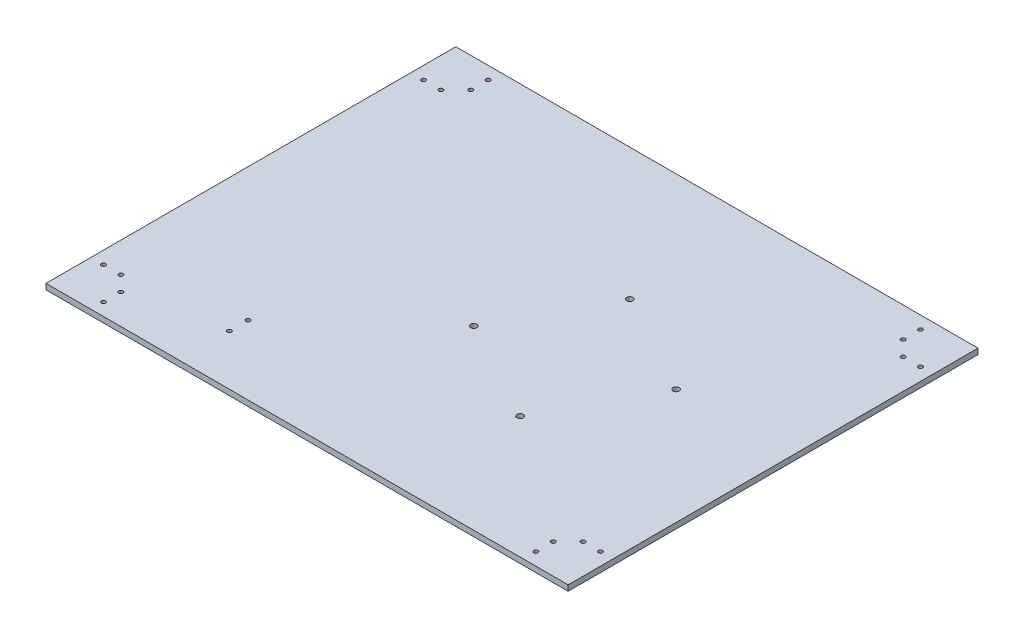
ISO-10303-21;
HEADER;
FILE_DESCRIPTION(('STEP AP214'),'2;1');
FILE_NAME('part.step','',(''),(''),'','','');
FILE_SCHEMA(('AUTOMOTIVE_DESIGN { 1 0 10303 214 1 1 1 1 }'));
ENDSEC;
DATA;
#1=APPLICATION_CONTEXT('core data for automotive mechanical design processes');
#2=APPLICATION_PROTOCOL_DEFINITION('international standard','automotive_design',2000,#1);
#3=PRODUCT_CONTEXT('',#1,'mechanical');
#4=PRODUCT('Part','Part','',(#3));
#5=PRODUCT_RELATED_PRODUCT_CATEGORY('part','',(#4));
#6=PRODUCT_DEFINITION_FORMATION('','',#4);
#7=PRODUCT_DEFINITION_CONTEXT('part definition',#1,'design');
#8=PRODUCT_DEFINITION('design','',#6,#7);
#9=PRODUCT_DEFINITION_SHAPE('','',#8);
#10=(LENGTH_UNIT() NAMED_UNIT(*) SI_UNIT(.MILLI.,.METRE.));
#11=(NAMED_UNIT(*) PLANE_ANGLE_UNIT() SI_UNIT($,.RADIAN.));
#12=(NAMED_UNIT(*) SI_UNIT($,.STERADIAN.) SOLID_ANGLE_UNIT());
#13=UNCERTAINTY_MEASURE_WITH_UNIT(LENGTH_MEASURE(1.E-05),#10,'distance_accuracy_value','');
#14=(GEOMETRIC_REPRESENTATION_CONTEXT(3) GLOBAL_UNCERTAINTY_ASSIGNED_CONTEXT((#13)) GLOBAL_UNIT_ASSIGNED_CONTEXT((#10,
#11,#12)) REPRESENTATION_CONTEXT('',''));
#15=CARTESIAN_POINT('',(0.,0.,0.));
#16=DIRECTION('',(0.,0.,1.));
#17=DIRECTION('',(1.,0.,0.));
#18=AXIS2_PLACEMENT_3D('',#15,#16,#17);
#19=CARTESIAN_POINT('',(-279.,6.,-219.));
#20=DIRECTION('',(1.,0.,0.));
#21=DIRECTION('',(0.,0.,-1.));
#22=AXIS2_PLACEMENT_3D('',#19,#20,#21);
#23=PLANE('',#22);
#24=DIRECTION('',(0.,0.,1.));
#25=VECTOR('',#24,1.);
#26=CARTESIAN_POINT('',(-279.,0.,-219.));
#27=LINE('',#26,#25);
#28=CARTESIAN_POINT('',(-279.,0.,-219.));
#29=VERTEX_POINT('',#28);
#30=CARTESIAN_POINT('',(-279.,0.,219.));
#31=VERTEX_POINT('',#30);
#32=EDGE_CURVE('E103',#29,#31,#27,.T.);
#33=ORIENTED_EDGE('',*,*,#32,.T.);
#34=DIRECTION('',(0.,-1.,0.));
#35=VECTOR('',#34,1.);
#36=CARTESIAN_POINT('',(-279.,6.,219.));
#37=LINE('',#36,#35);
#38=CARTESIAN_POINT('',(-279.,6.,219.));
#39=VERTEX_POINT('',#38);
#40=EDGE_CURVE('E11',#39,#31,#37,.T.);
#41=ORIENTED_EDGE('',*,*,#40,.F.);
#42=DIRECTION('',(0.,0.,1.));
#43=VECTOR('',#42,1.);
#44=CARTESIAN_POINT('',(-279.,6.,-219.));
#45=LINE('',#44,#43);
#46=CARTESIAN_POINT('',(-279.,6.,-219.));
#47=VERTEX_POINT('',#46);
#48=EDGE_CURVE('E90',#47,#39,#45,.T.);
#49=ORIENTED_EDGE('',*,*,#48,.F.);
#50=DIRECTION('',(0.,-1.,0.));
#51=VECTOR('',#50,1.);
#52=CARTESIAN_POINT('',(-279.,6.,-219.));
#53=LINE('',#52,#51);
#54=EDGE_CURVE('E99',#47,#29,#53,.T.);
#55=ORIENTED_EDGE('',*,*,#54,.T.);
#56=EDGE_LOOP('',(#33,#41,#49,#55));
#57=FACE_BOUND('',#56,.T.);
#58=ADVANCED_FACE('F37',(#57),#23,.F.);
#59=CARTESIAN_POINT('',(-279.,6.,219.));
#60=DIRECTION('',(0.,0.,-1.));
#61=DIRECTION('',(-1.,0.,0.));
#62=AXIS2_PLACEMENT_3D('',#59,#60,#61);
#63=PLANE('',#62);
#64=DIRECTION('',(1.,0.,0.));
#65=VECTOR('',#64,1.);
#66=CARTESIAN_POINT('',(-279.,0.,219.));
#67=LINE('',#66,#65);
#68=CARTESIAN_POINT('',(279.,0.,219.));
#69=VERTEX_POINT('',#68);
#70=EDGE_CURVE('E94',#31,#69,#67,.T.);
#71=ORIENTED_EDGE('',*,*,#70,.T.);
#72=DIRECTION('',(0.,-1.,0.));
#73=VECTOR('',#72,1.);
#74=CARTESIAN_POINT('',(279.,6.,219.));
#75=LINE('',#74,#73);
#76=CARTESIAN_POINT('',(279.,6.,219.));
#77=VERTEX_POINT('',#76);
#78=EDGE_CURVE('E46',#77,#69,#75,.T.);
#79=ORIENTED_EDGE('',*,*,#78,.F.);
#80=DIRECTION('',(1.,0.,0.));
#81=VECTOR('',#80,1.);
#82=CARTESIAN_POINT('',(-279.,6.,219.));
#83=LINE('',#82,#81);
#84=EDGE_CURVE('E85',#39,#77,#83,.T.);
#85=ORIENTED_EDGE('',*,*,#84,.F.);
#86=ORIENTED_EDGE('',*,*,#40,.T.);
#87=EDGE_LOOP('',(#71,#79,#85,#86));
#88=FACE_BOUND('',#87,.T.);
#89=ADVANCED_FACE('F93',(#88),#63,.F.);
#90=CARTESIAN_POINT('',(279.,6.,-219.));
#91=DIRECTION('',(-1.,0.,0.));
#92=DIRECTION('',(0.,0.,1.));
#93=AXIS2_PLACEMENT_3D('',#90,#91,#92);
#94=PLANE('',#93);
#95=DIRECTION('',(0.,0.,-1.));
#96=VECTOR('',#95,1.);
#97=CARTESIAN_POINT('',(279.,0.,-219.));
#98=LINE('',#97,#96);
#99=CARTESIAN_POINT('',(279.,0.,-219.));
#100=VERTEX_POINT('',#99);
#101=EDGE_CURVE('E72',#69,#100,#98,.T.);
#102=ORIENTED_EDGE('',*,*,#101,.T.);
#103=DIRECTION('',(0.,-1.,0.));
#104=VECTOR('',#103,1.);
#105=CARTESIAN_POINT('',(279.,6.,-219.));
#106=LINE('',#105,#104);
#107=CARTESIAN_POINT('',(279.,6.,-219.));
#108=VERTEX_POINT('',#107);
#109=EDGE_CURVE('E95',#108,#100,#106,.T.);
#110=ORIENTED_EDGE('',*,*,#109,.F.);
#111=DIRECTION('',(0.,0.,-1.));
#112=VECTOR('',#111,1.);
#113=CARTESIAN_POINT('',(279.,6.,-219.));
#114=LINE('',#113,#112);
#115=EDGE_CURVE('E88',#77,#108,#114,.T.);
#116=ORIENTED_EDGE('',*,*,#115,.F.);
#117=ORIENTED_EDGE('',*,*,#78,.T.);
#118=EDGE_LOOP('',(#102,#110,#116,#117));
#119=FACE_BOUND('',#118,.T.);
#120=ADVANCED_FACE('F97',(#119),#94,.F.);
#121=CARTESIAN_POINT('',(-279.,6.,-219.));
#122=DIRECTION('',(0.,0.,1.));
#123=DIRECTION('',(1.,0.,0.));
#124=AXIS2_PLACEMENT_3D('',#121,#122,#123);
#125=PLANE('',#124);
#126=DIRECTION('',(-1.,0.,0.));
#127=VECTOR('',#126,1.);
#128=CARTESIAN_POINT('',(-279.,0.,-219.));
#129=LINE('',#128,#127);
#130=EDGE_CURVE('E78',#100,#29,#129,.T.);
#131=ORIENTED_EDGE('',*,*,#130,.T.);
#132=ORIENTED_EDGE('',*,*,#54,.F.);
#133=DIRECTION('',(-1.,0.,0.));
#134=VECTOR('',#133,1.);
#135=CARTESIAN_POINT('',(-279.,6.,-219.));
#136=LINE('',#135,#134);
#137=EDGE_CURVE('E55',#108,#47,#136,.T.);
#138=ORIENTED_EDGE('',*,*,#137,.F.);
#139=ORIENTED_EDGE('',*,*,#109,.T.);
#140=EDGE_LOOP('',(#131,#132,#138,#139));
#141=FACE_BOUND('',#140,.T.);
#142=ADVANCED_FACE('F228',(#141),#125,.F.);
#143=CARTESIAN_POINT('',(0.,6.,0.));
#144=DIRECTION('',(0.,1.,0.));
#145=DIRECTION('',(0.,0.,1.));
#146=AXIS2_PLACEMENT_3D('',#143,#144,#145);
#147=PLANE('',#146);
#148=CARTESIAN_POINT('',(-136.921607377057,6.,165.135242980903));
#149=DIRECTION('',(0.,1.,0.));
#150=DIRECTION('',(0.,0.,1.));
#151=AXIS2_PLACEMENT_3D('',#148,#149,#150);
#152=CIRCLE('',#151,2.25000000000001);
#153=CARTESIAN_POINT('',(-136.921607377057,6.,167.385242980903));
#154=VERTEX_POINT('',#153);
#155=EDGE_CURVE('E556',#154,#154,#152,.T.);
#156=ORIENTED_EDGE('',*,*,#155,.F.);
#157=EDGE_LOOP('',(#156));
#158=FACE_BOUND('',#157,.T.);
#159=CARTESIAN_POINT('',(-136.921607377057,6.,145.135242980903));
#160=DIRECTION('',(0.,1.,0.));
#161=DIRECTION('',(0.,0.,1.));
#162=AXIS2_PLACEMENT_3D('',#159,#160,#161);
#163=CIRCLE('',#162,2.25000000000001);
#164=CARTESIAN_POINT('',(-136.921607377057,6.,147.385242980903));
#165=VERTEX_POINT('',#164);
#166=EDGE_CURVE('E560',#165,#165,#163,.T.);
#167=ORIENTED_EDGE('',*,*,#166,.F.);
#168=EDGE_LOOP('',(#167));
#169=FACE_BOUND('',#168,.T.);
#170=CARTESIAN_POINT('',(-11.0471393696576,6.,29.950902321598));
#171=DIRECTION('',(0.,1.,0.));
#172=DIRECTION('',(0.,0.,1.));
#173=AXIS2_PLACEMENT_3D('',#170,#171,#172);
#174=CIRCLE('',#173,3.30000000000001);
#175=CARTESIAN_POINT('',(-11.0471393696576,6.,33.250902321598));
#176=VERTEX_POINT('',#175);
#177=EDGE_CURVE('E164',#176,#176,#174,.T.);
#178=ORIENTED_EDGE('',*,*,#177,.F.);
#179=EDGE_LOOP('',(#178));
#180=FACE_BOUND('',#179,.T.);
#181=CARTESIAN_POINT('',(97.1704024808377,6.,88.5459898732358));
#182=DIRECTION('',(0.,1.,0.));
#183=DIRECTION('',(0.,0.,1.));
#184=AXIS2_PLACEMENT_3D('',#181,#182,#183);
#185=CIRCLE('',#184,3.3);
#186=CARTESIAN_POINT('',(97.1704024808377,6.,91.8459898732358));
#187=VERTEX_POINT('',#186);
#188=EDGE_CURVE('E572',#187,#187,#185,.T.);
#189=ORIENTED_EDGE('',*,*,#188,.F.);
#190=EDGE_LOOP('',(#189));
#191=FACE_BOUND('',#190,.T.);
#192=CARTESIAN_POINT('',(47.547947966774,6.,-78.2666396454225));
#193=DIRECTION('',(0.,1.,0.));
#194=DIRECTION('',(0.,0.,1.));
#195=AXIS2_PLACEMENT_3D('',#192,#193,#194);
#196=CIRCLE('',#195,3.3);
#197=CARTESIAN_POINT('',(47.547947966774,6.,-74.9666396454225));
#198=VERTEX_POINT('',#197);
#199=EDGE_CURVE('E575',#198,#198,#196,.T.);
#200=ORIENTED_EDGE('',*,*,#199,.F.);
#201=EDGE_LOOP('',(#200));
#202=FACE_BOUND('',#201,.T.);
#203=CARTESIAN_POINT('',(155.765489817269,6.,-19.6715520937847));
#204=DIRECTION('',(0.,1.,0.));
#205=DIRECTION('',(0.,0.,1.));
#206=AXIS2_PLACEMENT_3D('',#203,#204,#205);
#207=CIRCLE('',#206,3.3);
#208=CARTESIAN_POINT('',(155.765489817269,6.,-16.3715520937847));
#209=VERTEX_POINT('',#208);
#210=EDGE_CURVE('E569',#209,#209,#207,.T.);
#211=ORIENTED_EDGE('',*,*,#210,.F.);
#212=EDGE_LOOP('',(#211));
#213=FACE_BOUND('',#212,.T.);
#214=CARTESIAN_POINT('',(265.5,6.,171.));
#215=DIRECTION('',(0.,1.,0.));
#216=DIRECTION('',(0.,0.,1.));
#217=AXIS2_PLACEMENT_3D('',#214,#215,#216);
#218=CIRCLE('',#217,2.24999999999996);
#219=CARTESIAN_POINT('',(265.5,6.,173.25));
#220=VERTEX_POINT('',#219);
#221=EDGE_CURVE('E187',#220,#220,#218,.T.);
#222=ORIENTED_EDGE('',*,*,#221,.F.);
#223=EDGE_LOOP('',(#222));
#224=FACE_BOUND('',#223,.T.);
#225=CARTESIAN_POINT('',(265.5,6.,-171.));
#226=DIRECTION('',(0.,1.,0.));
#227=DIRECTION('',(0.,0.,1.));
#228=AXIS2_PLACEMENT_3D('',#225,#226,#227);
#229=CIRCLE('',#228,2.24999999999996);
#230=CARTESIAN_POINT('',(265.5,6.,-168.75));
#231=VERTEX_POINT('',#230);
#232=EDGE_CURVE('E204',#231,#231,#229,.T.);
#233=ORIENTED_EDGE('',*,*,#232,.F.);
#234=EDGE_LOOP('',(#233));
#235=FACE_BOUND('',#234,.T.);
#236=CARTESIAN_POINT('',(247.,6.,-171.));
#237=DIRECTION('',(0.,1.,0.));
#238=DIRECTION('',(0.,0.,1.));
#239=AXIS2_PLACEMENT_3D('',#236,#237,#238);
#240=CIRCLE('',#239,2.25000000000001);
#241=CARTESIAN_POINT('',(247.,6.,-168.75));
#242=VERTEX_POINT('',#241);
#243=EDGE_CURVE('E201',#242,#242,#240,.T.);
#244=ORIENTED_EDGE('',*,*,#243,.F.);
#245=EDGE_LOOP('',(#244));
#246=FACE_BOUND('',#245,.T.);
#247=CARTESIAN_POINT('',(231.,6.,-187.));
#248=DIRECTION('',(0.,1.,0.));
#249=DIRECTION('',(0.,0.,1.));
#250=AXIS2_PLACEMENT_3D('',#247,#248,#249);
#251=CIRCLE('',#250,2.25000000000001);
#252=CARTESIAN_POINT('',(231.,6.,-184.75));
#253=VERTEX_POINT('',#252);
#254=EDGE_CURVE('E197',#253,#253,#251,.T.);
#255=ORIENTED_EDGE('',*,*,#254,.F.);
#256=EDGE_LOOP('',(#255));
#257=FACE_BOUND('',#256,.T.);
#258=CARTESIAN_POINT('',(-231.,6.,-187.));
#259=DIRECTION('',(0.,1.,0.));
#260=DIRECTION('',(0.,0.,1.));
#261=AXIS2_PLACEMENT_3D('',#258,#259,#260);
#262=CIRCLE('',#261,2.25000000000001);
#263=CARTESIAN_POINT('',(-231.,6.,-184.75));
#264=VERTEX_POINT('',#263);
#265=EDGE_CURVE('E215',#264,#264,#262,.T.);
#266=ORIENTED_EDGE('',*,*,#265,.F.);
#267=EDGE_LOOP('',(#266));
#268=FACE_BOUND('',#267,.T.);
#269=CARTESIAN_POINT('',(-247.,6.,-171.));
#270=DIRECTION('',(0.,1.,0.));
#271=DIRECTION('',(0.,0.,1.));
#272=AXIS2_PLACEMENT_3D('',#269,#270,#271);
#273=CIRCLE('',#272,2.25000000000001);
#274=CARTESIAN_POINT('',(-247.,6.,-168.75));
#275=VERTEX_POINT('',#274);
#276=EDGE_CURVE('E212',#275,#275,#273,.T.);
#277=ORIENTED_EDGE('',*,*,#276,.F.);
#278=EDGE_LOOP('',(#277));
#279=FACE_BOUND('',#278,.T.);
#280=CARTESIAN_POINT('',(-265.5,6.,-171.));
#281=DIRECTION('',(0.,1.,0.));
#282=DIRECTION('',(0.,0.,1.));
#283=AXIS2_PLACEMENT_3D('',#280,#281,#282);
#284=CIRCLE('',#283,2.24999999999996);
#285=CARTESIAN_POINT('',(-265.5,6.,-168.75));
#286=VERTEX_POINT('',#285);
#287=EDGE_CURVE('E209',#286,#286,#284,.T.);
#288=ORIENTED_EDGE('',*,*,#287,.F.);
#289=EDGE_LOOP('',(#288));
#290=FACE_BOUND('',#289,.T.);
#291=CARTESIAN_POINT('',(231.,6.,-205.5));
#292=DIRECTION('',(0.,1.,0.));
#293=DIRECTION('',(0.,0.,1.));
#294=AXIS2_PLACEMENT_3D('',#291,#292,#293);
#295=CIRCLE('',#294,2.25000000000001);
#296=CARTESIAN_POINT('',(231.,6.,-203.25));
#297=VERTEX_POINT('',#296);
#298=EDGE_CURVE('E200',#297,#297,#295,.T.);
#299=ORIENTED_EDGE('',*,*,#298,.F.);
#300=EDGE_LOOP('',(#299));
#301=FACE_BOUND('',#300,.T.);
#302=CARTESIAN_POINT('',(-265.5,6.,171.));
#303=DIRECTION('',(0.,1.,0.));
#304=DIRECTION('',(0.,0.,1.));
#305=AXIS2_PLACEMENT_3D('',#302,#303,#304);
#306=CIRCLE('',#305,2.24999999999996);
#307=CARTESIAN_POINT('',(-265.5,6.,173.25));
#308=VERTEX_POINT('',#307);
#309=EDGE_CURVE('E171',#308,#308,#306,.T.);
#310=ORIENTED_EDGE('',*,*,#309,.F.);
#311=EDGE_LOOP('',(#310));
#312=FACE_BOUND('',#311,.T.);
#313=CARTESIAN_POINT('',(-247.,6.,171.));
#314=DIRECTION('',(0.,1.,0.));
#315=DIRECTION('',(0.,0.,1.));
#316=AXIS2_PLACEMENT_3D('',#313,#314,#315);
#317=CIRCLE('',#316,2.25000000000001);
#318=CARTESIAN_POINT('',(-247.,6.,173.25));
#319=VERTEX_POINT('',#318);
#320=EDGE_CURVE('E175',#319,#319,#317,.T.);
#321=ORIENTED_EDGE('',*,*,#320,.F.);
#322=EDGE_LOOP('',(#321));
#323=FACE_BOUND('',#322,.T.);
#324=CARTESIAN_POINT('',(-231.,6.,187.));
#325=DIRECTION('',(0.,1.,0.));
#326=DIRECTION('',(0.,0.,1.));
#327=AXIS2_PLACEMENT_3D('',#324,#325,#326);
#328=CIRCLE('',#327,2.25000000000001);
#329=CARTESIAN_POINT('',(-231.,6.,189.25));
#330=VERTEX_POINT('',#329);
#331=EDGE_CURVE('E180',#330,#330,#328,.T.);
#332=ORIENTED_EDGE('',*,*,#331,.F.);
#333=EDGE_LOOP('',(#332));
#334=FACE_BOUND('',#333,.T.);
#335=CARTESIAN_POINT('',(-231.,6.,205.5));
#336=DIRECTION('',(0.,1.,0.));
#337=DIRECTION('',(0.,0.,1.));
#338=AXIS2_PLACEMENT_3D('',#335,#336,#337);
#339=CIRCLE('',#338,2.25000000000001);
#340=CARTESIAN_POINT('',(-231.,6.,207.75));
#341=VERTEX_POINT('',#340);
#342=EDGE_CURVE('E194',#341,#341,#339,.T.);
#343=ORIENTED_EDGE('',*,*,#342,.F.);
#344=EDGE_LOOP('',(#343));
#345=FACE_BOUND('',#344,.T.);
#346=CARTESIAN_POINT('',(231.,6.,205.5));
#347=DIRECTION('',(0.,1.,0.));
#348=DIRECTION('',(0.,0.,1.));
#349=AXIS2_PLACEMENT_3D('',#346,#347,#348);
#350=CIRCLE('',#349,2.25000000000001);
#351=CARTESIAN_POINT('',(231.,6.,207.75));
#352=VERTEX_POINT('',#351);
#353=EDGE_CURVE('E191',#352,#352,#350,.T.);
#354=ORIENTED_EDGE('',*,*,#353,.F.);
#355=EDGE_LOOP('',(#354));
#356=FACE_BOUND('',#355,.T.);
#357=CARTESIAN_POINT('',(231.,6.,187.));
#358=DIRECTION('',(0.,1.,0.));
#359=DIRECTION('',(0.,0.,1.));
#360=AXIS2_PLACEMENT_3D('',#357,#358,#359);
#361=CIRCLE('',#360,2.25000000000001);
#362=CARTESIAN_POINT('',(231.,6.,189.25));
#363=VERTEX_POINT('',#362);
#364=EDGE_CURVE('E188',#363,#363,#361,.T.);
#365=ORIENTED_EDGE('',*,*,#364,.F.);
#366=EDGE_LOOP('',(#365));
#367=FACE_BOUND('',#366,.T.);
#368=CARTESIAN_POINT('',(247.,6.,171.));
#369=DIRECTION('',(0.,1.,0.));
#370=DIRECTION('',(0.,0.,1.));
#371=AXIS2_PLACEMENT_3D('',#368,#369,#370);
#372=CIRCLE('',#371,2.25000000000001);
#373=CARTESIAN_POINT('',(247.,6.,173.25));
#374=VERTEX_POINT('',#373);
#375=EDGE_CURVE('E184',#374,#374,#372,.T.);
#376=ORIENTED_EDGE('',*,*,#375,.F.);
#377=EDGE_LOOP('',(#376));
#378=FACE_BOUND('',#377,.T.);
#379=CARTESIAN_POINT('',(-231.,6.,-205.5));
#380=DIRECTION('',(0.,1.,0.));
#381=DIRECTION('',(0.,0.,1.));
#382=AXIS2_PLACEMENT_3D('',#379,#380,#381);
#383=CIRCLE('',#382,2.25000000000001);
#384=CARTESIAN_POINT('',(-231.,6.,-203.25));
#385=VERTEX_POINT('',#384);
#386=EDGE_CURVE('E116',#385,#385,#383,.T.);
#387=ORIENTED_EDGE('',*,*,#386,.F.);
#388=EDGE_LOOP('',(#387));
#389=FACE_BOUND('',#388,.T.);
#390=ORIENTED_EDGE('',*,*,#48,.T.);
#391=ORIENTED_EDGE('',*,*,#84,.T.);
#392=ORIENTED_EDGE('',*,*,#115,.T.);
#393=ORIENTED_EDGE('',*,*,#137,.T.);
#394=EDGE_LOOP('',(#390,#391,#392,#393));
#395=FACE_BOUND('',#394,.T.);
#396=ADVANCED_FACE('F86',(#158,#169,#180,#191,#202,#213,#224,#235,#246,#257,#268,#279,#290,#301,
#312,#323,#334,#345,#356,#367,#378,#389,#395),#147,.T.);
#397=CARTESIAN_POINT('',(0.,0.,0.));
#398=DIRECTION('',(0.,1.,0.));
#399=DIRECTION('',(0.,0.,1.));
#400=AXIS2_PLACEMENT_3D('',#397,#398,#399);
#401=PLANE('',#400);
#402=CARTESIAN_POINT('',(-136.921607377057,0.,165.135242980903));
#403=DIRECTION('',(0.,-1.,0.));
#404=DIRECTION('',(0.,0.,-1.));
#405=AXIS2_PLACEMENT_3D('',#402,#403,#404);
#406=CIRCLE('',#405,2.25000000000001);
#407=CARTESIAN_POINT('',(-136.921607377057,0.,162.885242980903));
#408=VERTEX_POINT('',#407);
#409=EDGE_CURVE('E559',#408,#408,#406,.T.);
#410=ORIENTED_EDGE('',*,*,#409,.F.);
#411=EDGE_LOOP('',(#410));
#412=FACE_BOUND('',#411,.T.);
#413=CARTESIAN_POINT('',(-136.921607377057,0.,145.135242980903));
#414=DIRECTION('',(0.,-1.,0.));
#415=DIRECTION('',(0.,0.,-1.));
#416=AXIS2_PLACEMENT_3D('',#413,#414,#415);
#417=CIRCLE('',#416,2.25000000000001);
#418=CARTESIAN_POINT('',(-136.921607377057,0.,142.885242980903));
#419=VERTEX_POINT('',#418);
#420=EDGE_CURVE('E561',#419,#419,#417,.T.);
#421=ORIENTED_EDGE('',*,*,#420,.F.);
#422=EDGE_LOOP('',(#421));
#423=FACE_BOUND('',#422,.T.);
#424=CARTESIAN_POINT('',(-11.0471393696576,0.,29.950902321598));
#425=DIRECTION('',(0.,1.,0.));
#426=DIRECTION('',(0.,0.,1.));
#427=AXIS2_PLACEMENT_3D('',#424,#425,#426);
#428=CIRCLE('',#427,3.30000000000001);
#429=CARTESIAN_POINT('',(-11.0471393696576,0.,33.250902321598));
#430=VERTEX_POINT('',#429);
#431=EDGE_CURVE('E40',#430,#430,#428,.T.);
#432=ORIENTED_EDGE('',*,*,#431,.T.);
#433=EDGE_LOOP('',(#432));
#434=FACE_BOUND('',#433,.T.);
#435=CARTESIAN_POINT('',(97.1704024808377,0.,88.5459898732358));
#436=DIRECTION('',(0.,1.,0.));
#437=DIRECTION('',(0.,0.,1.));
#438=AXIS2_PLACEMENT_3D('',#435,#436,#437);
#439=CIRCLE('',#438,3.3);
#440=CARTESIAN_POINT('',(97.1704024808377,0.,91.8459898732358));
#441=VERTEX_POINT('',#440);
#442=EDGE_CURVE('E166',#441,#441,#439,.T.);
#443=ORIENTED_EDGE('',*,*,#442,.T.);
#444=EDGE_LOOP('',(#443));
#445=FACE_BOUND('',#444,.T.);
#446=CARTESIAN_POINT('',(47.547947966774,0.,-78.2666396454225));
#447=DIRECTION('',(0.,1.,0.));
#448=DIRECTION('',(0.,0.,1.));
#449=AXIS2_PLACEMENT_3D('',#446,#447,#448);
#450=CIRCLE('',#449,3.3);
#451=CARTESIAN_POINT('',(47.547947966774,0.,-74.9666396454225));
#452=VERTEX_POINT('',#451);
#453=EDGE_CURVE('E163',#452,#452,#450,.T.);
#454=ORIENTED_EDGE('',*,*,#453,.T.);
#455=EDGE_LOOP('',(#454));
#456=FACE_BOUND('',#455,.T.);
#457=CARTESIAN_POINT('',(155.765489817269,0.,-19.6715520937847));
#458=DIRECTION('',(0.,1.,0.));
#459=DIRECTION('',(0.,0.,1.));
#460=AXIS2_PLACEMENT_3D('',#457,#458,#459);
#461=CIRCLE('',#460,3.3);
#462=CARTESIAN_POINT('',(155.765489817269,0.,-16.3715520937847));
#463=VERTEX_POINT('',#462);
#464=EDGE_CURVE('E160',#463,#463,#461,.T.);
#465=ORIENTED_EDGE('',*,*,#464,.T.);
#466=EDGE_LOOP('',(#465));
#467=FACE_BOUND('',#466,.T.);
#468=CARTESIAN_POINT('',(265.5,0.,171.));
#469=DIRECTION('',(0.,1.,0.));
#470=DIRECTION('',(0.,0.,1.));
#471=AXIS2_PLACEMENT_3D('',#468,#469,#470);
#472=CIRCLE('',#471,2.24999999999996);
#473=CARTESIAN_POINT('',(265.5,0.,173.25));
#474=VERTEX_POINT('',#473);
#475=EDGE_CURVE('E106',#474,#474,#472,.T.);
#476=ORIENTED_EDGE('',*,*,#475,.T.);
#477=EDGE_LOOP('',(#476));
#478=FACE_BOUND('',#477,.T.);
#479=CARTESIAN_POINT('',(265.5,0.,-171.));
#480=DIRECTION('',(0.,1.,0.));
#481=DIRECTION('',(0.,0.,1.));
#482=AXIS2_PLACEMENT_3D('',#479,#480,#481);
#483=CIRCLE('',#482,2.24999999999996);
#484=CARTESIAN_POINT('',(265.5,0.,-168.75));
#485=VERTEX_POINT('',#484);
#486=EDGE_CURVE('E155',#485,#485,#483,.T.);
#487=ORIENTED_EDGE('',*,*,#486,.T.);
#488=EDGE_LOOP('',(#487));
#489=FACE_BOUND('',#488,.T.);
#490=CARTESIAN_POINT('',(247.,0.,-171.));
#491=DIRECTION('',(0.,1.,0.));
#492=DIRECTION('',(0.,0.,1.));
#493=AXIS2_PLACEMENT_3D('',#490,#491,#492);
#494=CIRCLE('',#493,2.25000000000001);
#495=CARTESIAN_POINT('',(247.,0.,-168.75));
#496=VERTEX_POINT('',#495);
#497=EDGE_CURVE('E152',#496,#496,#494,.T.);
#498=ORIENTED_EDGE('',*,*,#497,.T.);
#499=EDGE_LOOP('',(#498));
#500=FACE_BOUND('',#499,.T.);
#501=CARTESIAN_POINT('',(231.,0.,-187.));
#502=DIRECTION('',(0.,1.,0.));
#503=DIRECTION('',(0.,0.,1.));
#504=AXIS2_PLACEMENT_3D('',#501,#502,#503);
#505=CIRCLE('',#504,2.25000000000001);
#506=CARTESIAN_POINT('',(231.,0.,-184.75));
#507=VERTEX_POINT('',#506);
#508=EDGE_CURVE('E149',#507,#507,#505,.T.);
#509=ORIENTED_EDGE('',*,*,#508,.T.);
#510=EDGE_LOOP('',(#509));
#511=FACE_BOUND('',#510,.T.);
#512=CARTESIAN_POINT('',(-231.,0.,-187.));
#513=DIRECTION('',(0.,1.,0.));
#514=DIRECTION('',(0.,0.,1.));
#515=AXIS2_PLACEMENT_3D('',#512,#513,#514);
#516=CIRCLE('',#515,2.25000000000001);
#517=CARTESIAN_POINT('',(-231.,0.,-184.75));
#518=VERTEX_POINT('',#517);
#519=EDGE_CURVE('E146',#518,#518,#516,.T.);
#520=ORIENTED_EDGE('',*,*,#519,.T.);
#521=EDGE_LOOP('',(#520));
#522=FACE_BOUND('',#521,.T.);
#523=CARTESIAN_POINT('',(-247.,0.,-171.));
#524=DIRECTION('',(0.,1.,0.));
#525=DIRECTION('',(0.,0.,1.));
#526=AXIS2_PLACEMENT_3D('',#523,#524,#525);
#527=CIRCLE('',#526,2.25000000000001);
#528=CARTESIAN_POINT('',(-247.,0.,-168.75));
#529=VERTEX_POINT('',#528);
#530=EDGE_CURVE('E143',#529,#529,#527,.T.);
#531=ORIENTED_EDGE('',*,*,#530,.T.);
#532=EDGE_LOOP('',(#531));
#533=FACE_BOUND('',#532,.T.);
#534=CARTESIAN_POINT('',(-265.5,0.,-171.));
#535=DIRECTION('',(0.,1.,0.));
#536=DIRECTION('',(0.,0.,1.));
#537=AXIS2_PLACEMENT_3D('',#534,#535,#536);
#538=CIRCLE('',#537,2.24999999999996);
#539=CARTESIAN_POINT('',(-265.5,0.,-168.75));
#540=VERTEX_POINT('',#539);
#541=EDGE_CURVE('E140',#540,#540,#538,.T.);
#542=ORIENTED_EDGE('',*,*,#541,.T.);
#543=EDGE_LOOP('',(#542));
#544=FACE_BOUND('',#543,.T.);
#545=CARTESIAN_POINT('',(231.,0.,-205.5));
#546=DIRECTION('',(0.,1.,0.));
#547=DIRECTION('',(0.,0.,1.));
#548=AXIS2_PLACEMENT_3D('',#545,#546,#547);
#549=CIRCLE('',#548,2.25000000000001);
#550=CARTESIAN_POINT('',(231.,0.,-203.25));
#551=VERTEX_POINT('',#550);
#552=EDGE_CURVE('E137',#551,#551,#549,.T.);
#553=ORIENTED_EDGE('',*,*,#552,.T.);
#554=EDGE_LOOP('',(#553));
#555=FACE_BOUND('',#554,.T.);
#556=CARTESIAN_POINT('',(-265.5,0.,171.));
#557=DIRECTION('',(0.,1.,0.));
#558=DIRECTION('',(0.,0.,1.));
#559=AXIS2_PLACEMENT_3D('',#556,#557,#558);
#560=CIRCLE('',#559,2.24999999999996);
#561=CARTESIAN_POINT('',(-265.5,0.,173.25));
#562=VERTEX_POINT('',#561);
#563=EDGE_CURVE('E134',#562,#562,#560,.T.);
#564=ORIENTED_EDGE('',*,*,#563,.T.);
#565=EDGE_LOOP('',(#564));
#566=FACE_BOUND('',#565,.T.);
#567=CARTESIAN_POINT('',(-247.,0.,171.));
#568=DIRECTION('',(0.,1.,0.));
#569=DIRECTION('',(0.,0.,1.));
#570=AXIS2_PLACEMENT_3D('',#567,#568,#569);
#571=CIRCLE('',#570,2.25000000000001);
#572=CARTESIAN_POINT('',(-247.,0.,173.25));
#573=VERTEX_POINT('',#572);
#574=EDGE_CURVE('E131',#573,#573,#571,.T.);
#575=ORIENTED_EDGE('',*,*,#574,.T.);
#576=EDGE_LOOP('',(#575));
#577=FACE_BOUND('',#576,.T.);
#578=CARTESIAN_POINT('',(-231.,0.,187.));
#579=DIRECTION('',(0.,1.,0.));
#580=DIRECTION('',(0.,0.,1.));
#581=AXIS2_PLACEMENT_3D('',#578,#579,#580);
#582=CIRCLE('',#581,2.25000000000001);
#583=CARTESIAN_POINT('',(-231.,0.,189.25));
#584=VERTEX_POINT('',#583);
#585=EDGE_CURVE('E128',#584,#584,#582,.T.);
#586=ORIENTED_EDGE('',*,*,#585,.T.);
#587=EDGE_LOOP('',(#586));
#588=FACE_BOUND('',#587,.T.);
#589=CARTESIAN_POINT('',(-231.,0.,205.5));
#590=DIRECTION('',(0.,1.,0.));
#591=DIRECTION('',(0.,0.,1.));
#592=AXIS2_PLACEMENT_3D('',#589,#590,#591);
#593=CIRCLE('',#592,2.25000000000001);
#594=CARTESIAN_POINT('',(-231.,0.,207.75));
#595=VERTEX_POINT('',#594);
#596=EDGE_CURVE('E125',#595,#595,#593,.T.);
#597=ORIENTED_EDGE('',*,*,#596,.T.);
#598=EDGE_LOOP('',(#597));
#599=FACE_BOUND('',#598,.T.);
#600=CARTESIAN_POINT('',(231.,0.,205.5));
#601=DIRECTION('',(0.,1.,0.));
#602=DIRECTION('',(0.,0.,1.));
#603=AXIS2_PLACEMENT_3D('',#600,#601,#602);
#604=CIRCLE('',#603,2.25000000000001);
#605=CARTESIAN_POINT('',(231.,0.,207.75));
#606=VERTEX_POINT('',#605);
#607=EDGE_CURVE('E122',#606,#606,#604,.T.);
#608=ORIENTED_EDGE('',*,*,#607,.T.);
#609=EDGE_LOOP('',(#608));
#610=FACE_BOUND('',#609,.T.);
#611=CARTESIAN_POINT('',(231.,0.,187.));
#612=DIRECTION('',(0.,1.,0.));
#613=DIRECTION('',(0.,0.,1.));
#614=AXIS2_PLACEMENT_3D('',#611,#612,#613);
#615=CIRCLE('',#614,2.25000000000001);
#616=CARTESIAN_POINT('',(231.,0.,189.25));
#617=VERTEX_POINT('',#616);
#618=EDGE_CURVE('E119',#617,#617,#615,.T.);
#619=ORIENTED_EDGE('',*,*,#618,.T.);
#620=EDGE_LOOP('',(#619));
#621=FACE_BOUND('',#620,.T.);
#622=CARTESIAN_POINT('',(247.,0.,171.));
#623=DIRECTION('',(0.,1.,0.));
#624=DIRECTION('',(0.,0.,1.));
#625=AXIS2_PLACEMENT_3D('',#622,#623,#624);
#626=CIRCLE('',#625,2.25000000000001);
#627=CARTESIAN_POINT('',(247.,0.,173.25));
#628=VERTEX_POINT('',#627);
#629=EDGE_CURVE('E115',#628,#628,#626,.T.);
#630=ORIENTED_EDGE('',*,*,#629,.T.);
#631=EDGE_LOOP('',(#630));
#632=FACE_BOUND('',#631,.T.);
#633=CARTESIAN_POINT('',(-231.,0.,-205.5));
#634=DIRECTION('',(0.,1.,0.));
#635=DIRECTION('',(0.,0.,1.));
#636=AXIS2_PLACEMENT_3D('',#633,#634,#635);
#637=CIRCLE('',#636,2.25000000000001);
#638=CARTESIAN_POINT('',(-231.,0.,-203.25));
#639=VERTEX_POINT('',#638);
#640=EDGE_CURVE('E112',#639,#639,#637,.T.);
#641=ORIENTED_EDGE('',*,*,#640,.T.);
#642=EDGE_LOOP('',(#641));
#643=FACE_BOUND('',#642,.T.);
#644=ORIENTED_EDGE('',*,*,#32,.F.);
#645=ORIENTED_EDGE('',*,*,#130,.F.);
#646=ORIENTED_EDGE('',*,*,#101,.F.);
#647=ORIENTED_EDGE('',*,*,#70,.F.);
#648=EDGE_LOOP('',(#644,#645,#646,#647));
#649=FACE_BOUND('',#648,.T.);
#650=ADVANCED_FACE('F227',(#412,#423,#434,#445,#456,#467,#478,#489,#500,#511,#522,#533,#544,
#555,#566,#577,#588,#599,#610,#621,#632,#643,#649),#401,.F.);
#651=CARTESIAN_POINT('',(-231.,-4.,-205.5));
#652=DIRECTION('',(0.,1.,0.));
#653=DIRECTION('',(0.,0.,1.));
#654=AXIS2_PLACEMENT_3D('',#651,#652,#653);
#655=CYLINDRICAL_SURFACE('',#654,2.25000000000001);
#656=ORIENTED_EDGE('',*,*,#386,.T.);
#657=EDGE_LOOP('',(#656));
#658=FACE_BOUND('',#657,.T.);
#659=ORIENTED_EDGE('',*,*,#640,.F.);
#660=EDGE_LOOP('',(#659));
#661=FACE_BOUND('',#660,.T.);
#662=ADVANCED_FACE('F223',(#658,#661),#655,.F.);
#663=CARTESIAN_POINT('',(247.,-4.,171.));
#664=DIRECTION('',(0.,1.,0.));
#665=DIRECTION('',(0.,0.,1.));
#666=AXIS2_PLACEMENT_3D('',#663,#664,#665);
#667=CYLINDRICAL_SURFACE('',#666,2.25000000000001);
#668=ORIENTED_EDGE('',*,*,#375,.T.);
#669=EDGE_LOOP('',(#668));
#670=FACE_BOUND('',#669,.T.);
#671=ORIENTED_EDGE('',*,*,#629,.F.);
#672=EDGE_LOOP('',(#671));
#673=FACE_BOUND('',#672,.T.);
#674=ADVANCED_FACE('F269',(#670,#673),#667,.F.);
#675=CARTESIAN_POINT('',(231.,-4.,187.));
#676=DIRECTION('',(0.,1.,0.));
#677=DIRECTION('',(0.,0.,1.));
#678=AXIS2_PLACEMENT_3D('',#675,#676,#677);
#679=CYLINDRICAL_SURFACE('',#678,2.25000000000001);
#680=ORIENTED_EDGE('',*,*,#364,.T.);
#681=EDGE_LOOP('',(#680));
#682=FACE_BOUND('',#681,.T.);
#683=ORIENTED_EDGE('',*,*,#618,.F.);
#684=EDGE_LOOP('',(#683));
#685=FACE_BOUND('',#684,.T.);
#686=ADVANCED_FACE('F279',(#682,#685),#679,.F.);
#687=CARTESIAN_POINT('',(231.,-4.,205.5));
#688=DIRECTION('',(0.,1.,0.));
#689=DIRECTION('',(0.,0.,1.));
#690=AXIS2_PLACEMENT_3D('',#687,#688,#689);
#691=CYLINDRICAL_SURFACE('',#690,2.25000000000001);
#692=ORIENTED_EDGE('',*,*,#353,.T.);
#693=EDGE_LOOP('',(#692));
#694=FACE_BOUND('',#693,.T.);
#695=ORIENTED_EDGE('',*,*,#607,.F.);
#696=EDGE_LOOP('',(#695));
#697=FACE_BOUND('',#696,.T.);
#698=ADVANCED_FACE('F290',(#694,#697),#691,.F.);
#699=CARTESIAN_POINT('',(-231.,-4.,205.5));
#700=DIRECTION('',(0.,1.,0.));
#701=DIRECTION('',(0.,0.,1.));
#702=AXIS2_PLACEMENT_3D('',#699,#700,#701);
#703=CYLINDRICAL_SURFACE('',#702,2.25000000000001);
#704=ORIENTED_EDGE('',*,*,#342,.T.);
#705=EDGE_LOOP('',(#704));
#706=FACE_BOUND('',#705,.T.);
#707=ORIENTED_EDGE('',*,*,#596,.F.);
#708=EDGE_LOOP('',(#707));
#709=FACE_BOUND('',#708,.T.);
#710=ADVANCED_FACE('F301',(#706,#709),#703,.F.);
#711=CARTESIAN_POINT('',(-231.,-4.,187.));
#712=DIRECTION('',(0.,1.,0.));
#713=DIRECTION('',(0.,0.,1.));
#714=AXIS2_PLACEMENT_3D('',#711,#712,#713);
#715=CYLINDRICAL_SURFACE('',#714,2.25000000000001);
#716=ORIENTED_EDGE('',*,*,#331,.T.);
#717=EDGE_LOOP('',(#716));
#718=FACE_BOUND('',#717,.T.);
#719=ORIENTED_EDGE('',*,*,#585,.F.);
#720=EDGE_LOOP('',(#719));
#721=FACE_BOUND('',#720,.T.);
#722=ADVANCED_FACE('F312',(#718,#721),#715,.F.);
#723=CARTESIAN_POINT('',(-247.,-4.,171.));
#724=DIRECTION('',(0.,1.,0.));
#725=DIRECTION('',(0.,0.,1.));
#726=AXIS2_PLACEMENT_3D('',#723,#724,#725);
#727=CYLINDRICAL_SURFACE('',#726,2.25000000000001);
#728=ORIENTED_EDGE('',*,*,#320,.T.);
#729=EDGE_LOOP('',(#728));
#730=FACE_BOUND('',#729,.T.);
#731=ORIENTED_EDGE('',*,*,#574,.F.);
#732=EDGE_LOOP('',(#731));
#733=FACE_BOUND('',#732,.T.);
#734=ADVANCED_FACE('F323',(#730,#733),#727,.F.);
#735=CARTESIAN_POINT('',(-265.5,-4.,171.));
#736=DIRECTION('',(0.,1.,0.));
#737=DIRECTION('',(0.,0.,1.));
#738=AXIS2_PLACEMENT_3D('',#735,#736,#737);
#739=CYLINDRICAL_SURFACE('',#738,2.24999999999996);
#740=ORIENTED_EDGE('',*,*,#309,.T.);
#741=EDGE_LOOP('',(#740));
#742=FACE_BOUND('',#741,.T.);
#743=ORIENTED_EDGE('',*,*,#563,.F.);
#744=EDGE_LOOP('',(#743));
#745=FACE_BOUND('',#744,.T.);
#746=ADVANCED_FACE('F334',(#742,#745),#739,.F.);
#747=CARTESIAN_POINT('',(231.,-4.,-205.5));
#748=DIRECTION('',(0.,1.,0.));
#749=DIRECTION('',(0.,0.,1.));
#750=AXIS2_PLACEMENT_3D('',#747,#748,#749);
#751=CYLINDRICAL_SURFACE('',#750,2.25000000000001);
#752=ORIENTED_EDGE('',*,*,#298,.T.);
#753=EDGE_LOOP('',(#752));
#754=FACE_BOUND('',#753,.T.);
#755=ORIENTED_EDGE('',*,*,#552,.F.);
#756=EDGE_LOOP('',(#755));
#757=FACE_BOUND('',#756,.T.);
#758=ADVANCED_FACE('F345',(#754,#757),#751,.F.);
#759=CARTESIAN_POINT('',(-265.5,-4.,-171.));
#760=DIRECTION('',(0.,1.,0.));
#761=DIRECTION('',(0.,0.,1.));
#762=AXIS2_PLACEMENT_3D('',#759,#760,#761);
#763=CYLINDRICAL_SURFACE('',#762,2.24999999999996);
#764=ORIENTED_EDGE('',*,*,#287,.T.);
#765=EDGE_LOOP('',(#764));
#766=FACE_BOUND('',#765,.T.);
#767=ORIENTED_EDGE('',*,*,#541,.F.);
#768=EDGE_LOOP('',(#767));
#769=FACE_BOUND('',#768,.T.);
#770=ADVANCED_FACE('F355',(#766,#769),#763,.F.);
#771=CARTESIAN_POINT('',(-247.,-4.,-171.));
#772=DIRECTION('',(0.,1.,0.));
#773=DIRECTION('',(0.,0.,1.));
#774=AXIS2_PLACEMENT_3D('',#771,#772,#773);
#775=CYLINDRICAL_SURFACE('',#774,2.25000000000001);
#776=ORIENTED_EDGE('',*,*,#276,.T.);
#777=EDGE_LOOP('',(#776));
#778=FACE_BOUND('',#777,.T.);
#779=ORIENTED_EDGE('',*,*,#530,.F.);
#780=EDGE_LOOP('',(#779));
#781=FACE_BOUND('',#780,.T.);
#782=ADVANCED_FACE('F366',(#778,#781),#775,.F.);
#783=CARTESIAN_POINT('',(-231.,-4.,-187.));
#784=DIRECTION('',(0.,1.,0.));
#785=DIRECTION('',(0.,0.,1.));
#786=AXIS2_PLACEMENT_3D('',#783,#784,#785);
#787=CYLINDRICAL_SURFACE('',#786,2.25000000000001);
#788=ORIENTED_EDGE('',*,*,#265,.T.);
#789=EDGE_LOOP('',(#788));
#790=FACE_BOUND('',#789,.T.);
#791=ORIENTED_EDGE('',*,*,#519,.F.);
#792=EDGE_LOOP('',(#791));
#793=FACE_BOUND('',#792,.T.);
#794=ADVANCED_FACE('F377',(#790,#793),#787,.F.);
#795=CARTESIAN_POINT('',(231.,-4.,-187.));
#796=DIRECTION('',(0.,1.,0.));
#797=DIRECTION('',(0.,0.,1.));
#798=AXIS2_PLACEMENT_3D('',#795,#796,#797);
#799=CYLINDRICAL_SURFACE('',#798,2.25000000000001);
#800=ORIENTED_EDGE('',*,*,#254,.T.);
#801=EDGE_LOOP('',(#800));
#802=FACE_BOUND('',#801,.T.);
#803=ORIENTED_EDGE('',*,*,#508,.F.);
#804=EDGE_LOOP('',(#803));
#805=FACE_BOUND('',#804,.T.);
#806=ADVANCED_FACE('F388',(#802,#805),#799,.F.);
#807=CARTESIAN_POINT('',(247.,-4.,-171.));
#808=DIRECTION('',(0.,1.,0.));
#809=DIRECTION('',(0.,0.,1.));
#810=AXIS2_PLACEMENT_3D('',#807,#808,#809);
#811=CYLINDRICAL_SURFACE('',#810,2.25000000000001);
#812=ORIENTED_EDGE('',*,*,#243,.T.);
#813=EDGE_LOOP('',(#812));
#814=FACE_BOUND('',#813,.T.);
#815=ORIENTED_EDGE('',*,*,#497,.F.);
#816=EDGE_LOOP('',(#815));
#817=FACE_BOUND('',#816,.T.);
#818=ADVANCED_FACE('F399',(#814,#817),#811,.F.);
#819=CARTESIAN_POINT('',(265.5,-4.,-171.));
#820=DIRECTION('',(0.,1.,0.));
#821=DIRECTION('',(0.,0.,1.));
#822=AXIS2_PLACEMENT_3D('',#819,#820,#821);
#823=CYLINDRICAL_SURFACE('',#822,2.24999999999996);
#824=ORIENTED_EDGE('',*,*,#232,.T.);
#825=EDGE_LOOP('',(#824));
#826=FACE_BOUND('',#825,.T.);
#827=ORIENTED_EDGE('',*,*,#486,.F.);
#828=EDGE_LOOP('',(#827));
#829=FACE_BOUND('',#828,.T.);
#830=ADVANCED_FACE('F410',(#826,#829),#823,.F.);
#831=CARTESIAN_POINT('',(265.5,-4.,171.));
#832=DIRECTION('',(0.,1.,0.));
#833=DIRECTION('',(0.,0.,1.));
#834=AXIS2_PLACEMENT_3D('',#831,#832,#833);
#835=CYLINDRICAL_SURFACE('',#834,2.24999999999996);
#836=ORIENTED_EDGE('',*,*,#221,.T.);
#837=EDGE_LOOP('',(#836));
#838=FACE_BOUND('',#837,.T.);
#839=ORIENTED_EDGE('',*,*,#475,.F.);
#840=EDGE_LOOP('',(#839));
#841=FACE_BOUND('',#840,.T.);
#842=ADVANCED_FACE('F421',(#838,#841),#835,.F.);
#843=CARTESIAN_POINT('',(155.765489817269,-4.,-19.6715520937847));
#844=DIRECTION('',(0.,1.,0.));
#845=DIRECTION('',(0.,0.,1.));
#846=AXIS2_PLACEMENT_3D('',#843,#844,#845);
#847=CYLINDRICAL_SURFACE('',#846,3.3);
#848=ORIENTED_EDGE('',*,*,#210,.T.);
#849=EDGE_LOOP('',(#848));
#850=FACE_BOUND('',#849,.T.);
#851=ORIENTED_EDGE('',*,*,#464,.F.);
#852=EDGE_LOOP('',(#851));
#853=FACE_BOUND('',#852,.T.);
#854=ADVANCED_FACE('F432',(#850,#853),#847,.F.);
#855=CARTESIAN_POINT('',(47.547947966774,-4.,-78.2666396454225));
#856=DIRECTION('',(0.,1.,0.));
#857=DIRECTION('',(0.,0.,1.));
#858=AXIS2_PLACEMENT_3D('',#855,#856,#857);
#859=CYLINDRICAL_SURFACE('',#858,3.3);
#860=ORIENTED_EDGE('',*,*,#199,.T.);
#861=EDGE_LOOP('',(#860));
#862=FACE_BOUND('',#861,.T.);
#863=ORIENTED_EDGE('',*,*,#453,.F.);
#864=EDGE_LOOP('',(#863));
#865=FACE_BOUND('',#864,.T.);
#866=ADVANCED_FACE('F443',(#862,#865),#859,.F.);
#867=CARTESIAN_POINT('',(97.1704024808377,-4.,88.5459898732358));
#868=DIRECTION('',(0.,1.,0.));
#869=DIRECTION('',(0.,0.,1.));
#870=AXIS2_PLACEMENT_3D('',#867,#868,#869);
#871=CYLINDRICAL_SURFACE('',#870,3.3);
#872=ORIENTED_EDGE('',*,*,#188,.T.);
#873=EDGE_LOOP('',(#872));
#874=FACE_BOUND('',#873,.T.);
#875=ORIENTED_EDGE('',*,*,#442,.F.);
#876=EDGE_LOOP('',(#875));
#877=FACE_BOUND('',#876,.T.);
#878=ADVANCED_FACE('F454',(#874,#877),#871,.F.);
#879=CARTESIAN_POINT('',(-11.0471393696576,-4.,29.950902321598));
#880=DIRECTION('',(0.,1.,0.));
#881=DIRECTION('',(0.,0.,1.));
#882=AXIS2_PLACEMENT_3D('',#879,#880,#881);
#883=CYLINDRICAL_SURFACE('',#882,3.30000000000001);
#884=ORIENTED_EDGE('',*,*,#177,.T.);
#885=EDGE_LOOP('',(#884));
#886=FACE_BOUND('',#885,.T.);
#887=ORIENTED_EDGE('',*,*,#431,.F.);
#888=EDGE_LOOP('',(#887));
#889=FACE_BOUND('',#888,.T.);
#890=ADVANCED_FACE('F465',(#886,#889),#883,.F.);
#891=CARTESIAN_POINT('',(-136.921607377057,10.,145.135242980903));
#892=DIRECTION('',(0.,-1.,0.));
#893=DIRECTION('',(0.,0.,-1.));
#894=AXIS2_PLACEMENT_3D('',#891,#892,#893);
#895=CYLINDRICAL_SURFACE('',#894,2.25000000000001);
#896=ORIENTED_EDGE('',*,*,#166,.T.);
#897=EDGE_LOOP('',(#896));
#898=FACE_BOUND('',#897,.T.);
#899=ORIENTED_EDGE('',*,*,#420,.T.);
#900=EDGE_LOOP('',(#899));
#901=FACE_BOUND('',#900,.T.);
#902=ADVANCED_FACE('F475',(#898,#901),#895,.F.);
#903=CARTESIAN_POINT('',(-136.921607377057,10.,165.135242980903));
#904=DIRECTION('',(0.,-1.,0.));
#905=DIRECTION('',(0.,0.,-1.));
#906=AXIS2_PLACEMENT_3D('',#903,#904,#905);
#907=CYLINDRICAL_SURFACE('',#906,2.25000000000001);
#908=ORIENTED_EDGE('',*,*,#155,.T.);
#909=EDGE_LOOP('',(#908));
#910=FACE_BOUND('',#909,.T.);
#911=ORIENTED_EDGE('',*,*,#409,.T.);
#912=EDGE_LOOP('',(#911));
#913=FACE_BOUND('',#912,.T.);
#914=ADVANCED_FACE('F497',(#910,#913),#907,.F.);
#915=CLOSED_SHELL('',(#58,#89,#120,#142,#396,#650,#662,#674,#686,#698,#710,#722,#734,#746,#758,
#770,#782,#794,#806,#818,#830,#842,#854,#866,#878,#890,#902,#914));
#916=MANIFOLD_SOLID_BREP('B2',#915);
#917=ADVANCED_BREP_SHAPE_REPRESENTATION('',(#18,#916),#14);
#918=SHAPE_DEFINITION_REPRESENTATION(#9,#917);
ENDSEC;
END-ISO-10303-21;
